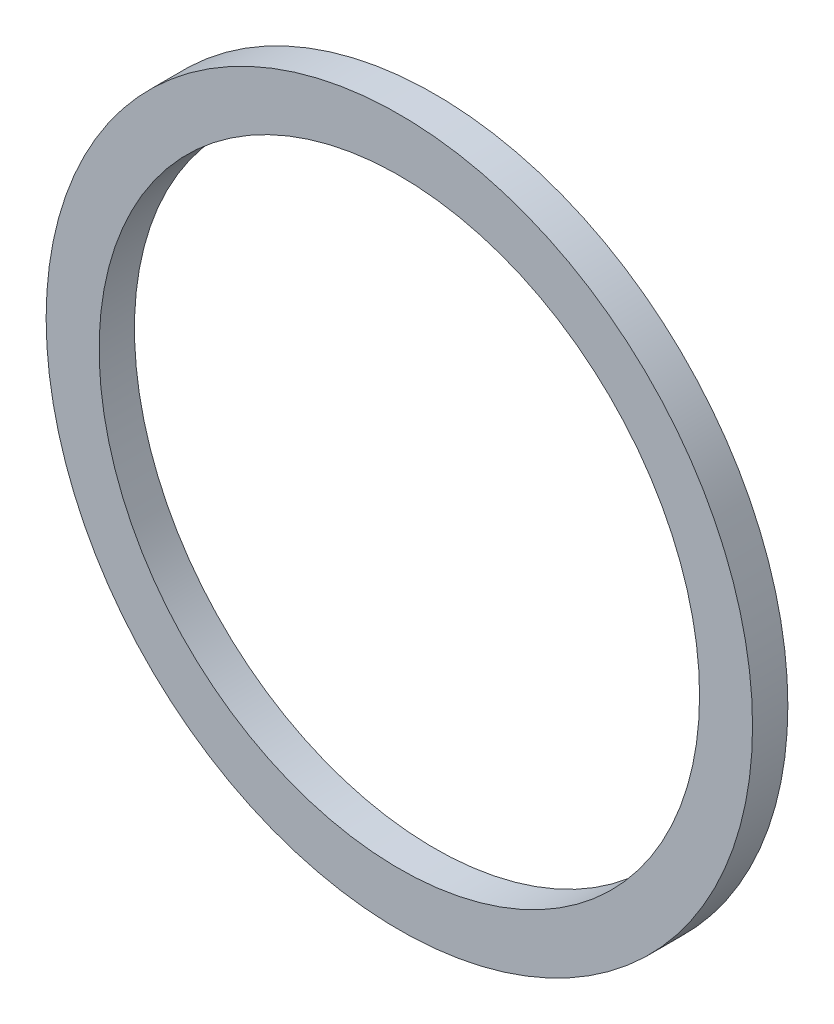
ISO-10303-21;
HEADER;
FILE_DESCRIPTION(('STEP AP214'),'2;1');
FILE_NAME('part.step','',(''),(''),'','','');
FILE_SCHEMA(('AUTOMOTIVE_DESIGN { 1 0 10303 214 1 1 1 1 }'));
ENDSEC;
DATA;
#1=APPLICATION_CONTEXT('core data for automotive mechanical design processes');
#2=APPLICATION_PROTOCOL_DEFINITION('international standard','automotive_design',2000,#1);
#3=PRODUCT_CONTEXT('',#1,'mechanical');
#4=PRODUCT('Part','Part','',(#3));
#5=PRODUCT_RELATED_PRODUCT_CATEGORY('part','',(#4));
#6=PRODUCT_DEFINITION_FORMATION('','',#4);
#7=PRODUCT_DEFINITION_CONTEXT('part definition',#1,'design');
#8=PRODUCT_DEFINITION('design','',#6,#7);
#9=PRODUCT_DEFINITION_SHAPE('','',#8);
#10=(LENGTH_UNIT() NAMED_UNIT(*) SI_UNIT(.MILLI.,.METRE.));
#11=(NAMED_UNIT(*) PLANE_ANGLE_UNIT() SI_UNIT($,.RADIAN.));
#12=(NAMED_UNIT(*) SI_UNIT($,.STERADIAN.) SOLID_ANGLE_UNIT());
#13=UNCERTAINTY_MEASURE_WITH_UNIT(LENGTH_MEASURE(1.E-05),#10,'distance_accuracy_value','');
#14=(GEOMETRIC_REPRESENTATION_CONTEXT(3) GLOBAL_UNCERTAINTY_ASSIGNED_CONTEXT((#13)) GLOBAL_UNIT_ASSIGNED_CONTEXT((#10,
#11,#12)) REPRESENTATION_CONTEXT('',''));
#15=CARTESIAN_POINT('',(0.,0.,0.));
#16=DIRECTION('',(0.,0.,1.));
#17=DIRECTION('',(1.,0.,0.));
#18=AXIS2_PLACEMENT_3D('',#15,#16,#17);
#19=CARTESIAN_POINT('',(0.,0.,1.));
#20=DIRECTION('',(0.,0.,1.));
#21=DIRECTION('',(1.,0.,0.));
#22=AXIS2_PLACEMENT_3D('',#19,#20,#21);
#23=PLANE('',#22);
#24=CARTESIAN_POINT('',(0.,0.,1.));
#25=DIRECTION('',(0.,0.,1.));
#26=DIRECTION('',(1.,0.,0.));
#27=AXIS2_PLACEMENT_3D('',#24,#25,#26);
#28=CIRCLE('',#27,10.);
#29=CARTESIAN_POINT('',(10.,0.,1.));
#30=VERTEX_POINT('',#29);
#31=EDGE_CURVE('E10',#30,#30,#28,.T.);
#32=ORIENTED_EDGE('',*,*,#31,.T.);
#33=EDGE_LOOP('',(#32));
#34=FACE_BOUND('',#33,.T.);
#35=CARTESIAN_POINT('',(0.,0.,1.));
#36=DIRECTION('',(0.,0.,1.));
#37=DIRECTION('',(1.,0.,0.));
#38=AXIS2_PLACEMENT_3D('',#35,#36,#37);
#39=CIRCLE('',#38,8.5);
#40=CARTESIAN_POINT('',(8.5,0.,1.));
#41=VERTEX_POINT('',#40);
#42=EDGE_CURVE('E41',#41,#41,#39,.T.);
#43=ORIENTED_EDGE('',*,*,#42,.F.);
#44=EDGE_LOOP('',(#43));
#45=FACE_BOUND('',#44,.T.);
#46=ADVANCED_FACE('F30',(#34,#45),#23,.T.);
#47=CARTESIAN_POINT('',(0.,0.,0.));
#48=DIRECTION('',(0.,0.,1.));
#49=DIRECTION('',(1.,0.,0.));
#50=AXIS2_PLACEMENT_3D('',#47,#48,#49);
#51=PLANE('',#50);
#52=CARTESIAN_POINT('',(0.,0.,0.));
#53=DIRECTION('',(0.,0.,1.));
#54=DIRECTION('',(1.,0.,0.));
#55=AXIS2_PLACEMENT_3D('',#52,#53,#54);
#56=CIRCLE('',#55,10.);
#57=CARTESIAN_POINT('',(10.,0.,0.));
#58=VERTEX_POINT('',#57);
#59=EDGE_CURVE('E34',#58,#58,#56,.T.);
#60=ORIENTED_EDGE('',*,*,#59,.F.);
#61=EDGE_LOOP('',(#60));
#62=FACE_BOUND('',#61,.T.);
#63=CARTESIAN_POINT('',(0.,0.,0.));
#64=DIRECTION('',(0.,0.,1.));
#65=DIRECTION('',(1.,0.,0.));
#66=AXIS2_PLACEMENT_3D('',#63,#64,#65);
#67=CIRCLE('',#66,8.5);
#68=CARTESIAN_POINT('',(8.5,0.,0.));
#69=VERTEX_POINT('',#68);
#70=EDGE_CURVE('E43',#69,#69,#67,.T.);
#71=ORIENTED_EDGE('',*,*,#70,.T.);
#72=EDGE_LOOP('',(#71));
#73=FACE_BOUND('',#72,.T.);
#74=ADVANCED_FACE('F53',(#62,#73),#51,.F.);
#75=CARTESIAN_POINT('',(0.,0.,1.));
#76=DIRECTION('',(0.,0.,-1.));
#77=DIRECTION('',(-1.,0.,0.));
#78=AXIS2_PLACEMENT_3D('',#75,#76,#77);
#79=CYLINDRICAL_SURFACE('',#78,10.);
#80=ORIENTED_EDGE('',*,*,#31,.F.);
#81=EDGE_LOOP('',(#80));
#82=FACE_BOUND('',#81,.T.);
#83=ORIENTED_EDGE('',*,*,#59,.T.);
#84=EDGE_LOOP('',(#83));
#85=FACE_BOUND('',#84,.T.);
#86=ADVANCED_FACE('F32',(#82,#85),#79,.T.);
#87=CARTESIAN_POINT('',(0.,0.,1.));
#88=DIRECTION('',(0.,0.,-1.));
#89=DIRECTION('',(-1.,0.,0.));
#90=AXIS2_PLACEMENT_3D('',#87,#88,#89);
#91=CYLINDRICAL_SURFACE('',#90,8.5);
#92=ORIENTED_EDGE('',*,*,#42,.T.);
#93=EDGE_LOOP('',(#92));
#94=FACE_BOUND('',#93,.T.);
#95=ORIENTED_EDGE('',*,*,#70,.F.);
#96=EDGE_LOOP('',(#95));
#97=FACE_BOUND('',#96,.T.);
#98=ADVANCED_FACE('F49',(#94,#97),#91,.F.);
#99=CLOSED_SHELL('',(#46,#74,#86,#98));
#100=MANIFOLD_SOLID_BREP('B2',#99);
#101=ADVANCED_BREP_SHAPE_REPRESENTATION('',(#18,#100),#14);
#102=SHAPE_DEFINITION_REPRESENTATION(#9,#101);
ENDSEC;
END-ISO-10303-21;
